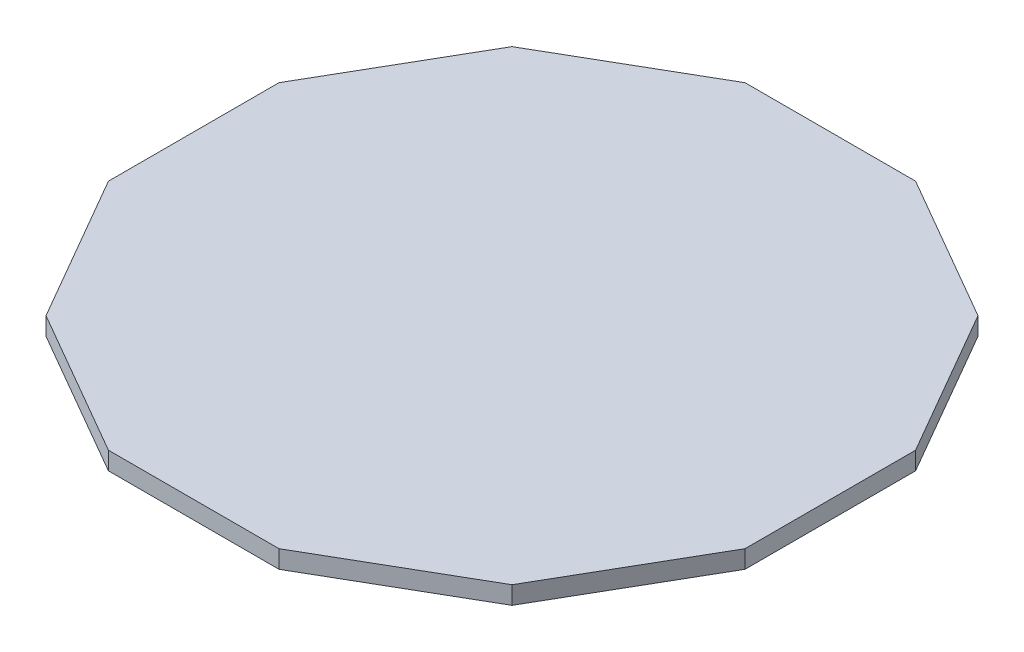
ISO-10303-21;
HEADER;
FILE_DESCRIPTION(('STEP AP214'),'2;1');
FILE_NAME('part.step','',(''),(''),'','','');
FILE_SCHEMA(('AUTOMOTIVE_DESIGN { 1 0 10303 214 1 1 1 1 }'));
ENDSEC;
DATA;
#1=APPLICATION_CONTEXT('core data for automotive mechanical design processes');
#2=APPLICATION_PROTOCOL_DEFINITION('international standard','automotive_design',2000,#1);
#3=PRODUCT_CONTEXT('',#1,'mechanical');
#4=PRODUCT('Part','Part','',(#3));
#5=PRODUCT_RELATED_PRODUCT_CATEGORY('part','',(#4));
#6=PRODUCT_DEFINITION_FORMATION('','',#4);
#7=PRODUCT_DEFINITION_CONTEXT('part definition',#1,'design');
#8=PRODUCT_DEFINITION('design','',#6,#7);
#9=PRODUCT_DEFINITION_SHAPE('','',#8);
#10=(LENGTH_UNIT() NAMED_UNIT(*) SI_UNIT(.MILLI.,.METRE.));
#11=(NAMED_UNIT(*) PLANE_ANGLE_UNIT() SI_UNIT($,.RADIAN.));
#12=(NAMED_UNIT(*) SI_UNIT($,.STERADIAN.) SOLID_ANGLE_UNIT());
#13=UNCERTAINTY_MEASURE_WITH_UNIT(LENGTH_MEASURE(1.E-05),#10,'distance_accuracy_value','');
#14=(GEOMETRIC_REPRESENTATION_CONTEXT(3) GLOBAL_UNCERTAINTY_ASSIGNED_CONTEXT((#13)) GLOBAL_UNIT_ASSIGNED_CONTEXT((#10,
#11,#12)) REPRESENTATION_CONTEXT('',''));
#15=CARTESIAN_POINT('',(0.,0.,0.));
#16=DIRECTION('',(0.,0.,1.));
#17=DIRECTION('',(1.,0.,0.));
#18=AXIS2_PLACEMENT_3D('',#15,#16,#17);
#19=CARTESIAN_POINT('',(0.,-2.921,0.));
#20=DIRECTION('',(0.,1.,0.));
#21=DIRECTION('',(0.,0.,1.));
#22=AXIS2_PLACEMENT_3D('',#19,#20,#21);
#23=PLANE('',#22);
#24=DIRECTION('',(0.,0.,1.));
#25=VECTOR('',#24,1.);
#26=CARTESIAN_POINT('',(51.9900319754847,-2.92100000000001,13.9306870822994));
#27=LINE('',#26,#25);
#28=CARTESIAN_POINT('',(51.9900319754847,-2.92100000000001,-13.9306870822994));
#29=VERTEX_POINT('',#28);
#30=CARTESIAN_POINT('',(51.9900319754847,-2.92100000000001,13.9306870822994));
#31=VERTEX_POINT('',#30);
#32=EDGE_CURVE('E50',#29,#31,#27,.T.);
#33=ORIENTED_EDGE('',*,*,#32,.T.);
#34=DIRECTION('',(-0.500000000000001,0.,0.866025403784438));
#35=VECTOR('',#34,1.);
#36=CARTESIAN_POINT('',(38.0593448931853,-2.92100000000001,38.0593448931853));
#37=LINE('',#36,#35);
#38=CARTESIAN_POINT('',(38.0593448931853,-2.92100000000001,38.0593448931853));
#39=VERTEX_POINT('',#38);
#40=EDGE_CURVE('E244',#31,#39,#37,.T.);
#41=ORIENTED_EDGE('',*,*,#40,.T.);
#42=DIRECTION('',(-0.866025403784438,0.,0.500000000000001));
#43=VECTOR('',#42,1.);
#44=CARTESIAN_POINT('',(13.9306870822994,-2.92100000000001,51.9900319754847));
#45=LINE('',#44,#43);
#46=CARTESIAN_POINT('',(13.9306870822994,-2.92100000000001,51.9900319754847));
#47=VERTEX_POINT('',#46);
#48=EDGE_CURVE('E247',#39,#47,#45,.T.);
#49=ORIENTED_EDGE('',*,*,#48,.T.);
#50=DIRECTION('',(-1.,0.,0.));
#51=VECTOR('',#50,1.);
#52=CARTESIAN_POINT('',(-13.9306870822994,-2.92100000000001,51.9900319754847));
#53=LINE('',#52,#51);
#54=CARTESIAN_POINT('',(-13.9306870822994,-2.92100000000001,51.9900319754847));
#55=VERTEX_POINT('',#54);
#56=EDGE_CURVE('E248',#47,#55,#53,.T.);
#57=ORIENTED_EDGE('',*,*,#56,.T.);
#58=DIRECTION('',(-0.866025403784438,0.,-0.500000000000001));
#59=VECTOR('',#58,1.);
#60=CARTESIAN_POINT('',(-38.0593448931853,-2.92100000000001,38.0593448931853));
#61=LINE('',#60,#59);
#62=CARTESIAN_POINT('',(-38.0593448931853,-2.92100000000001,38.0593448931853));
#63=VERTEX_POINT('',#62);
#64=EDGE_CURVE('E235',#55,#63,#61,.T.);
#65=ORIENTED_EDGE('',*,*,#64,.T.);
#66=DIRECTION('',(-0.500000000000001,0.,-0.866025403784438));
#67=VECTOR('',#66,1.);
#68=CARTESIAN_POINT('',(-51.9900319754847,-2.92100000000001,13.9306870822994));
#69=LINE('',#68,#67);
#70=CARTESIAN_POINT('',(-51.9900319754847,-2.92100000000001,13.9306870822994));
#71=VERTEX_POINT('',#70);
#72=EDGE_CURVE('E229',#63,#71,#69,.T.);
#73=ORIENTED_EDGE('',*,*,#72,.T.);
#74=DIRECTION('',(0.,0.,-1.));
#75=VECTOR('',#74,1.);
#76=CARTESIAN_POINT('',(-51.9900319754847,-2.92100000000001,-13.9306870822994));
#77=LINE('',#76,#75);
#78=CARTESIAN_POINT('',(-51.9900319754847,-2.92100000000001,-13.9306870822994));
#79=VERTEX_POINT('',#78);
#80=EDGE_CURVE('E254',#71,#79,#77,.T.);
#81=ORIENTED_EDGE('',*,*,#80,.T.);
#82=DIRECTION('',(0.5,0.,-0.866025403784439));
#83=VECTOR('',#82,1.);
#84=CARTESIAN_POINT('',(-38.0593448931853,-2.92100000000001,-38.0593448931853));
#85=LINE('',#84,#83);
#86=CARTESIAN_POINT('',(-38.0593448931853,-2.92100000000001,-38.0593448931853));
#87=VERTEX_POINT('',#86);
#88=EDGE_CURVE('E218',#79,#87,#85,.T.);
#89=ORIENTED_EDGE('',*,*,#88,.T.);
#90=DIRECTION('',(0.866025403784439,0.,-0.5));
#91=VECTOR('',#90,1.);
#92=CARTESIAN_POINT('',(-13.9306870822994,-2.92100000000001,-51.9900319754847));
#93=LINE('',#92,#91);
#94=CARTESIAN_POINT('',(-13.9306870822994,-2.92100000000001,-51.9900319754847));
#95=VERTEX_POINT('',#94);
#96=EDGE_CURVE('E212',#87,#95,#93,.T.);
#97=ORIENTED_EDGE('',*,*,#96,.T.);
#98=DIRECTION('',(1.,0.,0.));
#99=VECTOR('',#98,1.);
#100=CARTESIAN_POINT('',(13.9306870822994,-2.92100000000001,-51.9900319754847));
#101=LINE('',#100,#99);
#102=CARTESIAN_POINT('',(13.9306870822994,-2.92100000000001,-51.9900319754847));
#103=VERTEX_POINT('',#102);
#104=EDGE_CURVE('E88',#95,#103,#101,.T.);
#105=ORIENTED_EDGE('',*,*,#104,.T.);
#106=DIRECTION('',(0.866025403784439,0.,0.5));
#107=VECTOR('',#106,1.);
#108=CARTESIAN_POINT('',(38.0593448931853,-2.92100000000001,-38.0593448931853));
#109=LINE('',#108,#107);
#110=CARTESIAN_POINT('',(38.0593448931853,-2.92100000000001,-38.0593448931853));
#111=VERTEX_POINT('',#110);
#112=EDGE_CURVE('E92',#103,#111,#109,.T.);
#113=ORIENTED_EDGE('',*,*,#112,.T.);
#114=DIRECTION('',(0.5,0.,0.866025403784439));
#115=VECTOR('',#114,1.);
#116=CARTESIAN_POINT('',(51.9900319754847,-2.92100000000001,-13.9306870822994));
#117=LINE('',#116,#115);
#118=EDGE_CURVE('E11',#111,#29,#117,.T.);
#119=ORIENTED_EDGE('',*,*,#118,.T.);
#120=EDGE_LOOP('',(#33,#41,#49,#57,#65,#73,#81,#89,#97,#105,#113,#119));
#121=FACE_BOUND('',#120,.T.);
#122=ADVANCED_FACE('F40',(#121),#23,.F.);
#123=CARTESIAN_POINT('',(51.9900319754847,-149.971016655883,-13.9306870822994));
#124=DIRECTION('',(0.866025403784439,0.,-0.5));
#125=DIRECTION('',(-0.5,0.,-0.866025403784439));
#126=AXIS2_PLACEMENT_3D('',#123,#124,#125);
#127=PLANE('',#126);
#128=ORIENTED_EDGE('',*,*,#118,.F.);
#129=DIRECTION('',(0.,1.,0.));
#130=VECTOR('',#129,1.);
#131=CARTESIAN_POINT('',(38.0593448931853,-149.971016655883,-38.0593448931853));
#132=LINE('',#131,#130);
#133=CARTESIAN_POINT('',(38.0593448931853,0.,-38.0593448931853));
#134=VERTEX_POINT('',#133);
#135=EDGE_CURVE('E141',#111,#134,#132,.T.);
#136=ORIENTED_EDGE('',*,*,#135,.T.);
#137=DIRECTION('',(-0.5,0.,-0.866025403784439));
#138=VECTOR('',#137,1.);
#139=CARTESIAN_POINT('',(51.9900319754847,0.,-13.9306870822994));
#140=LINE('',#139,#138);
#141=CARTESIAN_POINT('',(51.9900319754847,0.,-13.9306870822994));
#142=VERTEX_POINT('',#141);
#143=EDGE_CURVE('E144',#142,#134,#140,.T.);
#144=ORIENTED_EDGE('',*,*,#143,.F.);
#145=DIRECTION('',(0.,1.,0.));
#146=VECTOR('',#145,1.);
#147=CARTESIAN_POINT('',(51.9900319754847,-149.971016655883,-13.9306870822994));
#148=LINE('',#147,#146);
#149=EDGE_CURVE('E44',#29,#142,#148,.T.);
#150=ORIENTED_EDGE('',*,*,#149,.F.);
#151=EDGE_LOOP('',(#128,#136,#144,#150));
#152=FACE_BOUND('',#151,.T.);
#153=ADVANCED_FACE('F145',(#152),#127,.T.);
#154=CARTESIAN_POINT('',(38.0593448931853,-149.971016655883,-38.0593448931853));
#155=DIRECTION('',(0.5,0.,-0.866025403784439));
#156=DIRECTION('',(-0.866025403784439,0.,-0.5));
#157=AXIS2_PLACEMENT_3D('',#154,#155,#156);
#158=PLANE('',#157);
#159=ORIENTED_EDGE('',*,*,#112,.F.);
#160=DIRECTION('',(0.,1.,0.));
#161=VECTOR('',#160,1.);
#162=CARTESIAN_POINT('',(13.9306870822994,-149.971016655883,-51.9900319754847));
#163=LINE('',#162,#161);
#164=CARTESIAN_POINT('',(13.9306870822994,0.,-51.9900319754847));
#165=VERTEX_POINT('',#164);
#166=EDGE_CURVE('E198',#103,#165,#163,.T.);
#167=ORIENTED_EDGE('',*,*,#166,.T.);
#168=DIRECTION('',(-0.866025403784438,0.,-0.5));
#169=VECTOR('',#168,1.);
#170=CARTESIAN_POINT('',(38.0593448931853,0.,-38.0593448931853));
#171=LINE('',#170,#169);
#172=EDGE_CURVE('E149',#134,#165,#171,.T.);
#173=ORIENTED_EDGE('',*,*,#172,.F.);
#174=ORIENTED_EDGE('',*,*,#135,.F.);
#175=EDGE_LOOP('',(#159,#167,#173,#174));
#176=FACE_BOUND('',#175,.T.);
#177=ADVANCED_FACE('F202',(#176),#158,.T.);
#178=CARTESIAN_POINT('',(13.9306870822994,-149.971016655883,-51.9900319754847));
#179=DIRECTION('',(0.,0.,-1.));
#180=DIRECTION('',(-1.,0.,0.));
#181=AXIS2_PLACEMENT_3D('',#178,#179,#180);
#182=PLANE('',#181);
#183=ORIENTED_EDGE('',*,*,#104,.F.);
#184=DIRECTION('',(0.,1.,0.));
#185=VECTOR('',#184,1.);
#186=CARTESIAN_POINT('',(-13.9306870822994,-149.971016655883,-51.9900319754847));
#187=LINE('',#186,#185);
#188=CARTESIAN_POINT('',(-13.9306870822994,0.,-51.9900319754847));
#189=VERTEX_POINT('',#188);
#190=EDGE_CURVE('E196',#95,#189,#187,.T.);
#191=ORIENTED_EDGE('',*,*,#190,.T.);
#192=DIRECTION('',(-1.,0.,0.));
#193=VECTOR('',#192,1.);
#194=CARTESIAN_POINT('',(13.9306870822994,0.,-51.9900319754847));
#195=LINE('',#194,#193);
#196=EDGE_CURVE('E157',#165,#189,#195,.T.);
#197=ORIENTED_EDGE('',*,*,#196,.F.);
#198=ORIENTED_EDGE('',*,*,#166,.F.);
#199=EDGE_LOOP('',(#183,#191,#197,#198));
#200=FACE_BOUND('',#199,.T.);
#201=ADVANCED_FACE('F204',(#200),#182,.T.);
#202=CARTESIAN_POINT('',(-13.9306870822994,-149.971016655883,-51.9900319754847));
#203=DIRECTION('',(-0.5,0.,-0.866025403784439));
#204=DIRECTION('',(-0.866025403784439,0.,0.5));
#205=AXIS2_PLACEMENT_3D('',#202,#203,#204);
#206=PLANE('',#205);
#207=ORIENTED_EDGE('',*,*,#96,.F.);
#208=DIRECTION('',(0.,1.,0.));
#209=VECTOR('',#208,1.);
#210=CARTESIAN_POINT('',(-38.0593448931853,-149.971016655883,-38.0593448931853));
#211=LINE('',#210,#209);
#212=CARTESIAN_POINT('',(-38.0593448931853,0.,-38.0593448931853));
#213=VERTEX_POINT('',#212);
#214=EDGE_CURVE('E194',#87,#213,#211,.T.);
#215=ORIENTED_EDGE('',*,*,#214,.T.);
#216=DIRECTION('',(-0.866025403784439,0.,0.5));
#217=VECTOR('',#216,1.);
#218=CARTESIAN_POINT('',(-13.9306870822994,0.,-51.9900319754847));
#219=LINE('',#218,#217);
#220=EDGE_CURVE('E160',#189,#213,#219,.T.);
#221=ORIENTED_EDGE('',*,*,#220,.F.);
#222=ORIENTED_EDGE('',*,*,#190,.F.);
#223=EDGE_LOOP('',(#207,#215,#221,#222));
#224=FACE_BOUND('',#223,.T.);
#225=ADVANCED_FACE('F210',(#224),#206,.T.);
#226=CARTESIAN_POINT('',(-38.0593448931853,-149.971016655883,-38.0593448931853));
#227=DIRECTION('',(-0.866025403784439,0.,-0.5));
#228=DIRECTION('',(-0.5,0.,0.866025403784439));
#229=AXIS2_PLACEMENT_3D('',#226,#227,#228);
#230=PLANE('',#229);
#231=ORIENTED_EDGE('',*,*,#88,.F.);
#232=DIRECTION('',(0.,1.,0.));
#233=VECTOR('',#232,1.);
#234=CARTESIAN_POINT('',(-51.9900319754847,-149.971016655883,-13.9306870822994));
#235=LINE('',#234,#233);
#236=CARTESIAN_POINT('',(-51.9900319754847,0.,-13.9306870822994));
#237=VERTEX_POINT('',#236);
#238=EDGE_CURVE('E192',#79,#237,#235,.T.);
#239=ORIENTED_EDGE('',*,*,#238,.T.);
#240=DIRECTION('',(-0.5,0.,0.866025403784439));
#241=VECTOR('',#240,1.);
#242=CARTESIAN_POINT('',(-38.0593448931853,0.,-38.0593448931853));
#243=LINE('',#242,#241);
#244=EDGE_CURVE('E163',#213,#237,#243,.T.);
#245=ORIENTED_EDGE('',*,*,#244,.F.);
#246=ORIENTED_EDGE('',*,*,#214,.F.);
#247=EDGE_LOOP('',(#231,#239,#245,#246));
#248=FACE_BOUND('',#247,.T.);
#249=ADVANCED_FACE('F215',(#248),#230,.T.);
#250=CARTESIAN_POINT('',(-51.9900319754847,-149.971016655883,-13.9306870822994));
#251=DIRECTION('',(-1.,0.,0.));
#252=DIRECTION('',(0.,0.,1.));
#253=AXIS2_PLACEMENT_3D('',#250,#251,#252);
#254=PLANE('',#253);
#255=ORIENTED_EDGE('',*,*,#80,.F.);
#256=DIRECTION('',(0.,1.,0.));
#257=VECTOR('',#256,1.);
#258=CARTESIAN_POINT('',(-51.9900319754847,-149.971016655883,13.9306870822994));
#259=LINE('',#258,#257);
#260=CARTESIAN_POINT('',(-51.9900319754847,0.,13.9306870822994));
#261=VERTEX_POINT('',#260);
#262=EDGE_CURVE('E190',#71,#261,#259,.T.);
#263=ORIENTED_EDGE('',*,*,#262,.T.);
#264=DIRECTION('',(0.,0.,1.));
#265=VECTOR('',#264,1.);
#266=CARTESIAN_POINT('',(-51.9900319754847,0.,-13.9306870822994));
#267=LINE('',#266,#265);
#268=EDGE_CURVE('E166',#237,#261,#267,.T.);
#269=ORIENTED_EDGE('',*,*,#268,.F.);
#270=ORIENTED_EDGE('',*,*,#238,.F.);
#271=EDGE_LOOP('',(#255,#263,#269,#270));
#272=FACE_BOUND('',#271,.T.);
#273=ADVANCED_FACE('F221',(#272),#254,.T.);
#274=CARTESIAN_POINT('',(-51.9900319754847,-149.971016655883,13.9306870822994));
#275=DIRECTION('',(-0.866025403784438,0.,0.500000000000001));
#276=DIRECTION('',(0.500000000000001,0.,0.866025403784438));
#277=AXIS2_PLACEMENT_3D('',#274,#275,#276);
#278=PLANE('',#277);
#279=ORIENTED_EDGE('',*,*,#72,.F.);
#280=DIRECTION('',(0.,1.,0.));
#281=VECTOR('',#280,1.);
#282=CARTESIAN_POINT('',(-38.0593448931853,-149.971016655883,38.0593448931853));
#283=LINE('',#282,#281);
#284=CARTESIAN_POINT('',(-38.0593448931853,0.,38.0593448931853));
#285=VERTEX_POINT('',#284);
#286=EDGE_CURVE('E188',#63,#285,#283,.T.);
#287=ORIENTED_EDGE('',*,*,#286,.T.);
#288=DIRECTION('',(0.500000000000001,0.,0.866025403784438));
#289=VECTOR('',#288,1.);
#290=CARTESIAN_POINT('',(-51.9900319754847,0.,13.9306870822994));
#291=LINE('',#290,#289);
#292=EDGE_CURVE('E169',#261,#285,#291,.T.);
#293=ORIENTED_EDGE('',*,*,#292,.F.);
#294=ORIENTED_EDGE('',*,*,#262,.F.);
#295=EDGE_LOOP('',(#279,#287,#293,#294));
#296=FACE_BOUND('',#295,.T.);
#297=ADVANCED_FACE('F227',(#296),#278,.T.);
#298=CARTESIAN_POINT('',(-38.0593448931853,-149.971016655883,38.0593448931853));
#299=DIRECTION('',(-0.500000000000001,0.,0.866025403784438));
#300=DIRECTION('',(0.866025403784438,0.,0.500000000000001));
#301=AXIS2_PLACEMENT_3D('',#298,#299,#300);
#302=PLANE('',#301);
#303=ORIENTED_EDGE('',*,*,#64,.F.);
#304=DIRECTION('',(0.,1.,0.));
#305=VECTOR('',#304,1.);
#306=CARTESIAN_POINT('',(-13.9306870822994,-149.971016655883,51.9900319754847));
#307=LINE('',#306,#305);
#308=CARTESIAN_POINT('',(-13.9306870822994,0.,51.9900319754847));
#309=VERTEX_POINT('',#308);
#310=EDGE_CURVE('E186',#55,#309,#307,.T.);
#311=ORIENTED_EDGE('',*,*,#310,.T.);
#312=DIRECTION('',(0.866025403784438,0.,0.500000000000001));
#313=VECTOR('',#312,1.);
#314=CARTESIAN_POINT('',(-38.0593448931853,0.,38.0593448931853));
#315=LINE('',#314,#313);
#316=EDGE_CURVE('E172',#285,#309,#315,.T.);
#317=ORIENTED_EDGE('',*,*,#316,.F.);
#318=ORIENTED_EDGE('',*,*,#286,.F.);
#319=EDGE_LOOP('',(#303,#311,#317,#318));
#320=FACE_BOUND('',#319,.T.);
#321=ADVANCED_FACE('F232',(#320),#302,.T.);
#322=CARTESIAN_POINT('',(-13.9306870822994,-149.971016655883,51.9900319754847));
#323=DIRECTION('',(0.,0.,1.));
#324=DIRECTION('',(1.,0.,0.));
#325=AXIS2_PLACEMENT_3D('',#322,#323,#324);
#326=PLANE('',#325);
#327=ORIENTED_EDGE('',*,*,#56,.F.);
#328=DIRECTION('',(0.,1.,0.));
#329=VECTOR('',#328,1.);
#330=CARTESIAN_POINT('',(13.9306870822994,-149.971016655883,51.9900319754847));
#331=LINE('',#330,#329);
#332=CARTESIAN_POINT('',(13.9306870822994,0.,51.9900319754847));
#333=VERTEX_POINT('',#332);
#334=EDGE_CURVE('E184',#47,#333,#331,.T.);
#335=ORIENTED_EDGE('',*,*,#334,.T.);
#336=DIRECTION('',(1.,0.,0.));
#337=VECTOR('',#336,1.);
#338=CARTESIAN_POINT('',(-13.9306870822994,0.,51.9900319754847));
#339=LINE('',#338,#337);
#340=EDGE_CURVE('E175',#309,#333,#339,.T.);
#341=ORIENTED_EDGE('',*,*,#340,.F.);
#342=ORIENTED_EDGE('',*,*,#310,.F.);
#343=EDGE_LOOP('',(#327,#335,#341,#342));
#344=FACE_BOUND('',#343,.T.);
#345=ADVANCED_FACE('F238',(#344),#326,.T.);
#346=CARTESIAN_POINT('',(13.9306870822994,-149.971016655883,51.9900319754847));
#347=DIRECTION('',(0.500000000000001,0.,0.866025403784438));
#348=DIRECTION('',(0.866025403784438,0.,-0.500000000000001));
#349=AXIS2_PLACEMENT_3D('',#346,#347,#348);
#350=PLANE('',#349);
#351=ORIENTED_EDGE('',*,*,#48,.F.);
#352=DIRECTION('',(0.,1.,0.));
#353=VECTOR('',#352,1.);
#354=CARTESIAN_POINT('',(38.0593448931853,-149.971016655883,38.0593448931853));
#355=LINE('',#354,#353);
#356=CARTESIAN_POINT('',(38.0593448931853,0.,38.0593448931853));
#357=VERTEX_POINT('',#356);
#358=EDGE_CURVE('E182',#39,#357,#355,.T.);
#359=ORIENTED_EDGE('',*,*,#358,.T.);
#360=DIRECTION('',(0.866025403784438,0.,-0.500000000000001));
#361=VECTOR('',#360,1.);
#362=CARTESIAN_POINT('',(13.9306870822994,0.,51.9900319754847));
#363=LINE('',#362,#361);
#364=EDGE_CURVE('E178',#333,#357,#363,.T.);
#365=ORIENTED_EDGE('',*,*,#364,.F.);
#366=ORIENTED_EDGE('',*,*,#334,.F.);
#367=EDGE_LOOP('',(#351,#359,#365,#366));
#368=FACE_BOUND('',#367,.T.);
#369=ADVANCED_FACE('F246',(#368),#350,.T.);
#370=CARTESIAN_POINT('',(38.0593448931853,-149.971016655883,38.0593448931853));
#371=DIRECTION('',(0.866025403784438,0.,0.500000000000001));
#372=DIRECTION('',(0.500000000000001,0.,-0.866025403784438));
#373=AXIS2_PLACEMENT_3D('',#370,#371,#372);
#374=PLANE('',#373);
#375=ORIENTED_EDGE('',*,*,#40,.F.);
#376=DIRECTION('',(0.,1.,0.));
#377=VECTOR('',#376,1.);
#378=CARTESIAN_POINT('',(51.9900319754847,-149.971016655883,13.9306870822994));
#379=LINE('',#378,#377);
#380=CARTESIAN_POINT('',(51.9900319754847,0.,13.9306870822994));
#381=VERTEX_POINT('',#380);
#382=EDGE_CURVE('E99',#31,#381,#379,.T.);
#383=ORIENTED_EDGE('',*,*,#382,.T.);
#384=DIRECTION('',(0.500000000000001,0.,-0.866025403784438));
#385=VECTOR('',#384,1.);
#386=CARTESIAN_POINT('',(38.0593448931853,0.,38.0593448931853));
#387=LINE('',#386,#385);
#388=EDGE_CURVE('E142',#357,#381,#387,.T.);
#389=ORIENTED_EDGE('',*,*,#388,.F.);
#390=ORIENTED_EDGE('',*,*,#358,.F.);
#391=EDGE_LOOP('',(#375,#383,#389,#390));
#392=FACE_BOUND('',#391,.T.);
#393=ADVANCED_FACE('F243',(#392),#374,.T.);
#394=CARTESIAN_POINT('',(51.9900319754847,-149.971016655883,13.9306870822994));
#395=DIRECTION('',(1.,0.,0.));
#396=DIRECTION('',(0.,0.,-1.));
#397=AXIS2_PLACEMENT_3D('',#394,#395,#396);
#398=PLANE('',#397);
#399=ORIENTED_EDGE('',*,*,#32,.F.);
#400=ORIENTED_EDGE('',*,*,#149,.T.);
#401=DIRECTION('',(0.,0.,-1.));
#402=VECTOR('',#401,1.);
#403=CARTESIAN_POINT('',(51.9900319754847,0.,13.9306870822994));
#404=LINE('',#403,#402);
#405=EDGE_CURVE('E138',#381,#142,#404,.T.);
#406=ORIENTED_EDGE('',*,*,#405,.F.);
#407=ORIENTED_EDGE('',*,*,#382,.F.);
#408=EDGE_LOOP('',(#399,#400,#406,#407));
#409=FACE_BOUND('',#408,.T.);
#410=ADVANCED_FACE('F136',(#409),#398,.T.);
#411=CARTESIAN_POINT('',(0.,0.,0.));
#412=DIRECTION('',(0.,1.,0.));
#413=DIRECTION('',(0.,0.,1.));
#414=AXIS2_PLACEMENT_3D('',#411,#412,#413);
#415=PLANE('',#414);
#416=ORIENTED_EDGE('',*,*,#405,.T.);
#417=ORIENTED_EDGE('',*,*,#143,.T.);
#418=ORIENTED_EDGE('',*,*,#172,.T.);
#419=ORIENTED_EDGE('',*,*,#196,.T.);
#420=ORIENTED_EDGE('',*,*,#220,.T.);
#421=ORIENTED_EDGE('',*,*,#244,.T.);
#422=ORIENTED_EDGE('',*,*,#268,.T.);
#423=ORIENTED_EDGE('',*,*,#292,.T.);
#424=ORIENTED_EDGE('',*,*,#316,.T.);
#425=ORIENTED_EDGE('',*,*,#340,.T.);
#426=ORIENTED_EDGE('',*,*,#364,.T.);
#427=ORIENTED_EDGE('',*,*,#388,.T.);
#428=EDGE_LOOP('',(#416,#417,#418,#419,#420,#421,#422,#423,#424,#425,#426,#427));
#429=FACE_BOUND('',#428,.T.);
#430=ADVANCED_FACE('F42',(#429),#415,.T.);
#431=CLOSED_SHELL('',(#122,#153,#177,#201,#225,#249,#273,#297,#321,#345,#369,#393,#410,#430));
#432=MANIFOLD_SOLID_BREP('B2',#431);
#433=ADVANCED_BREP_SHAPE_REPRESENTATION('',(#18,#432),#14);
#434=SHAPE_DEFINITION_REPRESENTATION(#9,#433);
ENDSEC;
END-ISO-10303-21;
